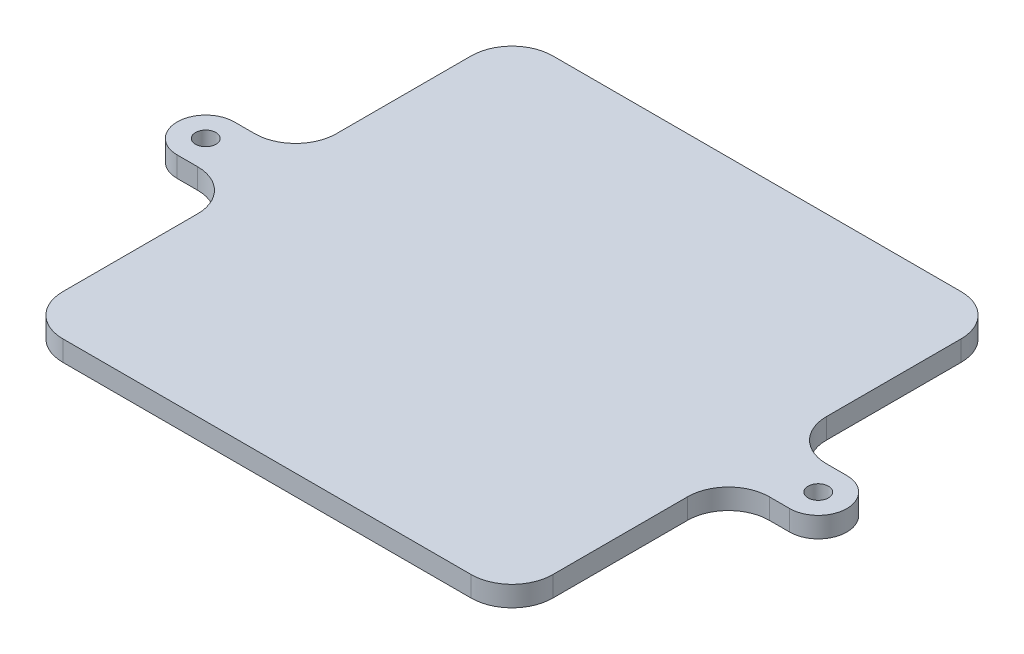
ISO-10303-21;
HEADER;
FILE_DESCRIPTION(('STEP AP214'),'2;1');
FILE_NAME('part.step','',(''),(''),'','','');
FILE_SCHEMA(('AUTOMOTIVE_DESIGN { 1 0 10303 214 1 1 1 1 }'));
ENDSEC;
DATA;
#1=APPLICATION_CONTEXT('core data for automotive mechanical design processes');
#2=APPLICATION_PROTOCOL_DEFINITION('international standard','automotive_design',2000,#1);
#3=PRODUCT_CONTEXT('',#1,'mechanical');
#4=PRODUCT('Part','Part','',(#3));
#5=PRODUCT_RELATED_PRODUCT_CATEGORY('part','',(#4));
#6=PRODUCT_DEFINITION_FORMATION('','',#4);
#7=PRODUCT_DEFINITION_CONTEXT('part definition',#1,'design');
#8=PRODUCT_DEFINITION('design','',#6,#7);
#9=PRODUCT_DEFINITION_SHAPE('','',#8);
#10=(LENGTH_UNIT() NAMED_UNIT(*) SI_UNIT(.MILLI.,.METRE.));
#11=(NAMED_UNIT(*) PLANE_ANGLE_UNIT() SI_UNIT($,.RADIAN.));
#12=(NAMED_UNIT(*) SI_UNIT($,.STERADIAN.) SOLID_ANGLE_UNIT());
#13=UNCERTAINTY_MEASURE_WITH_UNIT(LENGTH_MEASURE(1.E-05),#10,'distance_accuracy_value','');
#14=(GEOMETRIC_REPRESENTATION_CONTEXT(3) GLOBAL_UNCERTAINTY_ASSIGNED_CONTEXT((#13)) GLOBAL_UNIT_ASSIGNED_CONTEXT((#10,
#11,#12)) REPRESENTATION_CONTEXT('',''));
#15=CARTESIAN_POINT('',(0.,0.,0.));
#16=DIRECTION('',(0.,0.,1.));
#17=DIRECTION('',(1.,0.,0.));
#18=AXIS2_PLACEMENT_3D('',#15,#16,#17);
#19=CARTESIAN_POINT('',(70.,5.,17.));
#20=DIRECTION('',(0.,-1.,0.));
#21=DIRECTION('',(0.,0.,-1.));
#22=AXIS2_PLACEMENT_3D('',#19,#20,#21);
#23=PLANE('',#22);
#24=CARTESIAN_POINT('',(70.,5.,17.));
#25=DIRECTION('',(0.,-1.,0.));
#26=DIRECTION('',(0.,0.,-1.));
#27=AXIS2_PLACEMENT_3D('',#24,#25,#26);
#28=CIRCLE('',#27,10.);
#29=CARTESIAN_POINT('',(60.,5.,17.));
#30=VERTEX_POINT('',#29);
#31=CARTESIAN_POINT('',(70.,5.,6.99999999999999));
#32=VERTEX_POINT('',#31);
#33=EDGE_CURVE('E245',#30,#32,#28,.T.);
#34=ORIENTED_EDGE('',*,*,#33,.T.);
#35=DIRECTION('',(1.,0.,0.));
#36=VECTOR('',#35,1.);
#37=CARTESIAN_POINT('',(70.,5.,6.99999999999999));
#38=LINE('',#37,#36);
#39=CARTESIAN_POINT('',(75.,5.,6.99999999999999));
#40=VERTEX_POINT('',#39);
#41=EDGE_CURVE('E133',#32,#40,#38,.T.);
#42=ORIENTED_EDGE('',*,*,#41,.T.);
#43=CARTESIAN_POINT('',(75.,5.,0.));
#44=DIRECTION('',(0.,1.,0.));
#45=DIRECTION('',(0.,0.,-1.));
#46=AXIS2_PLACEMENT_3D('',#43,#44,#45);
#47=CIRCLE('',#46,7.);
#48=CARTESIAN_POINT('',(75.,5.,-7.00000000000001));
#49=VERTEX_POINT('',#48);
#50=EDGE_CURVE('E296',#40,#49,#47,.T.);
#51=ORIENTED_EDGE('',*,*,#50,.T.);
#52=DIRECTION('',(-1.,0.,0.));
#53=VECTOR('',#52,1.);
#54=CARTESIAN_POINT('',(70.,5.,-7.00000000000001));
#55=LINE('',#54,#53);
#56=CARTESIAN_POINT('',(70.,5.,-7.00000000000002));
#57=VERTEX_POINT('',#56);
#58=EDGE_CURVE('E315',#49,#57,#55,.T.);
#59=ORIENTED_EDGE('',*,*,#58,.T.);
#60=CARTESIAN_POINT('',(70.,5.,-17.));
#61=DIRECTION('',(0.,-1.,0.));
#62=DIRECTION('',(0.,0.,1.));
#63=AXIS2_PLACEMENT_3D('',#60,#61,#62);
#64=CIRCLE('',#63,9.99999999999999);
#65=CARTESIAN_POINT('',(60.,5.,-17.));
#66=VERTEX_POINT('',#65);
#67=EDGE_CURVE('E312',#57,#66,#64,.T.);
#68=ORIENTED_EDGE('',*,*,#67,.T.);
#69=DIRECTION('',(0.,0.,-1.));
#70=VECTOR('',#69,1.);
#71=CARTESIAN_POINT('',(60.,5.,-17.));
#72=LINE('',#71,#70);
#73=CARTESIAN_POINT('',(60.,5.,-49.9999999999999));
#74=VERTEX_POINT('',#73);
#75=EDGE_CURVE('E314',#66,#74,#72,.T.);
#76=ORIENTED_EDGE('',*,*,#75,.T.);
#77=CARTESIAN_POINT('',(50.,5.,-50.));
#78=DIRECTION('',(0.,1.,0.));
#79=DIRECTION('',(0.,0.,-1.));
#80=AXIS2_PLACEMENT_3D('',#77,#78,#79);
#81=CIRCLE('',#80,10.);
#82=CARTESIAN_POINT('',(49.9999999999999,5.,-60.));
#83=VERTEX_POINT('',#82);
#84=EDGE_CURVE('E317',#74,#83,#81,.T.);
#85=ORIENTED_EDGE('',*,*,#84,.T.);
#86=DIRECTION('',(-1.,0.,0.));
#87=VECTOR('',#86,1.);
#88=CARTESIAN_POINT('',(-49.9999999999999,5.,-60.));
#89=LINE('',#88,#87);
#90=CARTESIAN_POINT('',(-50.,5.,-60.));
#91=VERTEX_POINT('',#90);
#92=EDGE_CURVE('E323',#83,#91,#89,.T.);
#93=ORIENTED_EDGE('',*,*,#92,.T.);
#94=CARTESIAN_POINT('',(-50.,5.,-50.));
#95=DIRECTION('',(0.,1.,0.));
#96=DIRECTION('',(0.,0.,-1.));
#97=AXIS2_PLACEMENT_3D('',#94,#95,#96);
#98=CIRCLE('',#97,10.);
#99=CARTESIAN_POINT('',(-60.,5.,-49.9999999999999));
#100=VERTEX_POINT('',#99);
#101=EDGE_CURVE('E325',#91,#100,#98,.T.);
#102=ORIENTED_EDGE('',*,*,#101,.T.);
#103=DIRECTION('',(0.,0.,1.));
#104=VECTOR('',#103,1.);
#105=CARTESIAN_POINT('',(-60.,5.,-17.));
#106=LINE('',#105,#104);
#107=CARTESIAN_POINT('',(-60.,5.,-17.));
#108=VERTEX_POINT('',#107);
#109=EDGE_CURVE('E327',#100,#108,#106,.T.);
#110=ORIENTED_EDGE('',*,*,#109,.T.);
#111=CARTESIAN_POINT('',(-70.,5.,-17.));
#112=DIRECTION('',(0.,-1.,0.));
#113=DIRECTION('',(0.,0.,-1.));
#114=AXIS2_PLACEMENT_3D('',#111,#112,#113);
#115=CIRCLE('',#114,10.);
#116=CARTESIAN_POINT('',(-70.,5.,-6.99999999999999));
#117=VERTEX_POINT('',#116);
#118=EDGE_CURVE('E329',#108,#117,#115,.T.);
#119=ORIENTED_EDGE('',*,*,#118,.T.);
#120=DIRECTION('',(-1.,0.,0.));
#121=VECTOR('',#120,1.);
#122=CARTESIAN_POINT('',(-70.,5.,-6.99999999999999));
#123=LINE('',#122,#121);
#124=CARTESIAN_POINT('',(-75.,5.,-6.99999999999999));
#125=VERTEX_POINT('',#124);
#126=EDGE_CURVE('E331',#117,#125,#123,.T.);
#127=ORIENTED_EDGE('',*,*,#126,.T.);
#128=CARTESIAN_POINT('',(-75.,5.,0.));
#129=DIRECTION('',(0.,1.,0.));
#130=DIRECTION('',(0.,0.,1.));
#131=AXIS2_PLACEMENT_3D('',#128,#129,#130);
#132=CIRCLE('',#131,7.);
#133=CARTESIAN_POINT('',(-75.,5.,7.00000000000001));
#134=VERTEX_POINT('',#133);
#135=EDGE_CURVE('E333',#125,#134,#132,.T.);
#136=ORIENTED_EDGE('',*,*,#135,.T.);
#137=DIRECTION('',(1.,0.,0.));
#138=VECTOR('',#137,1.);
#139=CARTESIAN_POINT('',(-70.,5.,7.00000000000001));
#140=LINE('',#139,#138);
#141=CARTESIAN_POINT('',(-70.,5.,7.00000000000002));
#142=VERTEX_POINT('',#141);
#143=EDGE_CURVE('E335',#134,#142,#140,.T.);
#144=ORIENTED_EDGE('',*,*,#143,.T.);
#145=CARTESIAN_POINT('',(-70.,5.,17.));
#146=DIRECTION('',(0.,-1.,0.));
#147=DIRECTION('',(0.,0.,1.));
#148=AXIS2_PLACEMENT_3D('',#145,#146,#147);
#149=CIRCLE('',#148,9.99999999999999);
#150=CARTESIAN_POINT('',(-60.,5.,17.));
#151=VERTEX_POINT('',#150);
#152=EDGE_CURVE('E337',#142,#151,#149,.T.);
#153=ORIENTED_EDGE('',*,*,#152,.T.);
#154=DIRECTION('',(0.,0.,1.));
#155=VECTOR('',#154,1.);
#156=CARTESIAN_POINT('',(-60.,5.,49.9999999999999));
#157=LINE('',#156,#155);
#158=CARTESIAN_POINT('',(-60.,5.,49.9999999999999));
#159=VERTEX_POINT('',#158);
#160=EDGE_CURVE('E339',#151,#159,#157,.T.);
#161=ORIENTED_EDGE('',*,*,#160,.T.);
#162=CARTESIAN_POINT('',(-50.,5.,50.));
#163=DIRECTION('',(0.,1.,0.));
#164=DIRECTION('',(0.,0.,-1.));
#165=AXIS2_PLACEMENT_3D('',#162,#163,#164);
#166=CIRCLE('',#165,10.);
#167=CARTESIAN_POINT('',(-49.9999999999999,5.,60.));
#168=VERTEX_POINT('',#167);
#169=EDGE_CURVE('E188',#159,#168,#166,.T.);
#170=ORIENTED_EDGE('',*,*,#169,.T.);
#171=DIRECTION('',(1.,0.,0.));
#172=VECTOR('',#171,1.);
#173=CARTESIAN_POINT('',(-49.9999999999999,5.,60.));
#174=LINE('',#173,#172);
#175=CARTESIAN_POINT('',(49.9999999999999,5.,60.));
#176=VERTEX_POINT('',#175);
#177=EDGE_CURVE('E182',#168,#176,#174,.T.);
#178=ORIENTED_EDGE('',*,*,#177,.T.);
#179=CARTESIAN_POINT('',(50.,5.,50.));
#180=DIRECTION('',(0.,1.,0.));
#181=DIRECTION('',(0.,0.,1.));
#182=AXIS2_PLACEMENT_3D('',#179,#180,#181);
#183=CIRCLE('',#182,10.);
#184=CARTESIAN_POINT('',(60.,5.,49.9999999999999));
#185=VERTEX_POINT('',#184);
#186=EDGE_CURVE('E186',#176,#185,#183,.T.);
#187=ORIENTED_EDGE('',*,*,#186,.T.);
#188=DIRECTION('',(0.,0.,-1.));
#189=VECTOR('',#188,1.);
#190=CARTESIAN_POINT('',(60.,5.,49.9999999999999));
#191=LINE('',#190,#189);
#192=EDGE_CURVE('E54',#185,#30,#191,.T.);
#193=ORIENTED_EDGE('',*,*,#192,.T.);
#194=EDGE_LOOP('',(#34,#42,#51,#59,#68,#76,#85,#93,#102,#110,#119,#127,#136,#144,#153,#161,#170,
#178,#187,#193));
#195=FACE_BOUND('',#194,.T.);
#196=CARTESIAN_POINT('',(-75.,5.,0.));
#197=DIRECTION('',(0.,1.,0.));
#198=DIRECTION('',(0.,0.,1.));
#199=AXIS2_PLACEMENT_3D('',#196,#197,#198);
#200=CIRCLE('',#199,2.49999999999999);
#201=CARTESIAN_POINT('',(-75.,5.,2.5));
#202=VERTEX_POINT('',#201);
#203=EDGE_CURVE('E210',#202,#202,#200,.T.);
#204=ORIENTED_EDGE('',*,*,#203,.F.);
#205=EDGE_LOOP('',(#204));
#206=FACE_BOUND('',#205,.T.);
#207=CARTESIAN_POINT('',(75.,5.,0.));
#208=DIRECTION('',(0.,1.,0.));
#209=DIRECTION('',(0.,0.,-1.));
#210=AXIS2_PLACEMENT_3D('',#207,#208,#209);
#211=CIRCLE('',#210,2.49999999999999);
#212=CARTESIAN_POINT('',(75.,5.,-2.5));
#213=VERTEX_POINT('',#212);
#214=EDGE_CURVE('E380',#213,#213,#211,.T.);
#215=ORIENTED_EDGE('',*,*,#214,.F.);
#216=EDGE_LOOP('',(#215));
#217=FACE_BOUND('',#216,.T.);
#218=ADVANCED_FACE('F37',(#195,#206,#217),#23,.F.);
#219=CARTESIAN_POINT('',(70.,0.,17.));
#220=DIRECTION('',(0.,-1.,0.));
#221=DIRECTION('',(0.,0.,-1.));
#222=AXIS2_PLACEMENT_3D('',#219,#220,#221);
#223=PLANE('',#222);
#224=CARTESIAN_POINT('',(-75.,0.,0.));
#225=DIRECTION('',(0.,1.,0.));
#226=DIRECTION('',(0.,0.,1.));
#227=AXIS2_PLACEMENT_3D('',#224,#225,#226);
#228=CIRCLE('',#227,2.49999999999999);
#229=CARTESIAN_POINT('',(-75.,0.,2.5));
#230=VERTEX_POINT('',#229);
#231=EDGE_CURVE('E385',#230,#230,#228,.T.);
#232=ORIENTED_EDGE('',*,*,#231,.T.);
#233=EDGE_LOOP('',(#232));
#234=FACE_BOUND('',#233,.T.);
#235=CARTESIAN_POINT('',(70.,0.,17.));
#236=DIRECTION('',(0.,-1.,0.));
#237=DIRECTION('',(0.,0.,-1.));
#238=AXIS2_PLACEMENT_3D('',#235,#236,#237);
#239=CIRCLE('',#238,10.);
#240=CARTESIAN_POINT('',(60.,0.,17.));
#241=VERTEX_POINT('',#240);
#242=CARTESIAN_POINT('',(70.,0.,6.99999999999999));
#243=VERTEX_POINT('',#242);
#244=EDGE_CURVE('E206',#241,#243,#239,.T.);
#245=ORIENTED_EDGE('',*,*,#244,.F.);
#246=DIRECTION('',(0.,0.,-1.));
#247=VECTOR('',#246,1.);
#248=CARTESIAN_POINT('',(60.,0.,49.9999999999999));
#249=LINE('',#248,#247);
#250=CARTESIAN_POINT('',(60.,0.,49.9999999999999));
#251=VERTEX_POINT('',#250);
#252=EDGE_CURVE('E125',#251,#241,#249,.T.);
#253=ORIENTED_EDGE('',*,*,#252,.F.);
#254=CARTESIAN_POINT('',(50.,0.,50.));
#255=DIRECTION('',(0.,1.,0.));
#256=DIRECTION('',(0.,0.,1.));
#257=AXIS2_PLACEMENT_3D('',#254,#255,#256);
#258=CIRCLE('',#257,10.);
#259=CARTESIAN_POINT('',(49.9999999999999,0.,60.));
#260=VERTEX_POINT('',#259);
#261=EDGE_CURVE('E119',#260,#251,#258,.T.);
#262=ORIENTED_EDGE('',*,*,#261,.F.);
#263=DIRECTION('',(1.,0.,0.));
#264=VECTOR('',#263,1.);
#265=CARTESIAN_POINT('',(-49.9999999999999,0.,60.));
#266=LINE('',#265,#264);
#267=CARTESIAN_POINT('',(-49.9999999999999,0.,60.));
#268=VERTEX_POINT('',#267);
#269=EDGE_CURVE('E196',#268,#260,#266,.T.);
#270=ORIENTED_EDGE('',*,*,#269,.F.);
#271=CARTESIAN_POINT('',(-50.,0.,50.));
#272=DIRECTION('',(0.,1.,0.));
#273=DIRECTION('',(0.,0.,-1.));
#274=AXIS2_PLACEMENT_3D('',#271,#272,#273);
#275=CIRCLE('',#274,10.);
#276=CARTESIAN_POINT('',(-60.,0.,49.9999999999999));
#277=VERTEX_POINT('',#276);
#278=EDGE_CURVE('E240',#277,#268,#275,.T.);
#279=ORIENTED_EDGE('',*,*,#278,.F.);
#280=DIRECTION('',(0.,0.,1.));
#281=VECTOR('',#280,1.);
#282=CARTESIAN_POINT('',(-60.,0.,49.9999999999999));
#283=LINE('',#282,#281);
#284=CARTESIAN_POINT('',(-60.,0.,17.));
#285=VERTEX_POINT('',#284);
#286=EDGE_CURVE('E238',#285,#277,#283,.T.);
#287=ORIENTED_EDGE('',*,*,#286,.F.);
#288=CARTESIAN_POINT('',(-70.,0.,17.));
#289=DIRECTION('',(0.,-1.,0.));
#290=DIRECTION('',(0.,0.,1.));
#291=AXIS2_PLACEMENT_3D('',#288,#289,#290);
#292=CIRCLE('',#291,9.99999999999999);
#293=CARTESIAN_POINT('',(-70.,0.,7.00000000000002));
#294=VERTEX_POINT('',#293);
#295=EDGE_CURVE('E236',#294,#285,#292,.T.);
#296=ORIENTED_EDGE('',*,*,#295,.F.);
#297=DIRECTION('',(1.,0.,0.));
#298=VECTOR('',#297,1.);
#299=CARTESIAN_POINT('',(-70.,0.,7.00000000000001));
#300=LINE('',#299,#298);
#301=CARTESIAN_POINT('',(-75.,0.,7.00000000000001));
#302=VERTEX_POINT('',#301);
#303=EDGE_CURVE('E234',#302,#294,#300,.T.);
#304=ORIENTED_EDGE('',*,*,#303,.F.);
#305=CARTESIAN_POINT('',(-75.,0.,0.));
#306=DIRECTION('',(0.,1.,0.));
#307=DIRECTION('',(0.,0.,1.));
#308=AXIS2_PLACEMENT_3D('',#305,#306,#307);
#309=CIRCLE('',#308,7.);
#310=CARTESIAN_POINT('',(-75.,0.,-6.99999999999999));
#311=VERTEX_POINT('',#310);
#312=EDGE_CURVE('E232',#311,#302,#309,.T.);
#313=ORIENTED_EDGE('',*,*,#312,.F.);
#314=DIRECTION('',(-1.,0.,0.));
#315=VECTOR('',#314,1.);
#316=CARTESIAN_POINT('',(-70.,0.,-6.99999999999999));
#317=LINE('',#316,#315);
#318=CARTESIAN_POINT('',(-70.,0.,-6.99999999999999));
#319=VERTEX_POINT('',#318);
#320=EDGE_CURVE('E230',#319,#311,#317,.T.);
#321=ORIENTED_EDGE('',*,*,#320,.F.);
#322=CARTESIAN_POINT('',(-70.,0.,-17.));
#323=DIRECTION('',(0.,-1.,0.));
#324=DIRECTION('',(0.,0.,-1.));
#325=AXIS2_PLACEMENT_3D('',#322,#323,#324);
#326=CIRCLE('',#325,10.);
#327=CARTESIAN_POINT('',(-60.,0.,-17.));
#328=VERTEX_POINT('',#327);
#329=EDGE_CURVE('E228',#328,#319,#326,.T.);
#330=ORIENTED_EDGE('',*,*,#329,.F.);
#331=DIRECTION('',(0.,0.,1.));
#332=VECTOR('',#331,1.);
#333=CARTESIAN_POINT('',(-60.,0.,-17.));
#334=LINE('',#333,#332);
#335=CARTESIAN_POINT('',(-60.,0.,-49.9999999999999));
#336=VERTEX_POINT('',#335);
#337=EDGE_CURVE('E226',#336,#328,#334,.T.);
#338=ORIENTED_EDGE('',*,*,#337,.F.);
#339=CARTESIAN_POINT('',(-50.,0.,-50.));
#340=DIRECTION('',(0.,1.,0.));
#341=DIRECTION('',(0.,0.,-1.));
#342=AXIS2_PLACEMENT_3D('',#339,#340,#341);
#343=CIRCLE('',#342,10.);
#344=CARTESIAN_POINT('',(-50.,0.,-60.));
#345=VERTEX_POINT('',#344);
#346=EDGE_CURVE('E224',#345,#336,#343,.T.);
#347=ORIENTED_EDGE('',*,*,#346,.F.);
#348=DIRECTION('',(-1.,0.,0.));
#349=VECTOR('',#348,1.);
#350=CARTESIAN_POINT('',(-49.9999999999999,0.,-60.));
#351=LINE('',#350,#349);
#352=CARTESIAN_POINT('',(49.9999999999999,0.,-60.));
#353=VERTEX_POINT('',#352);
#354=EDGE_CURVE('E222',#353,#345,#351,.T.);
#355=ORIENTED_EDGE('',*,*,#354,.F.);
#356=CARTESIAN_POINT('',(50.,0.,-50.));
#357=DIRECTION('',(0.,1.,0.));
#358=DIRECTION('',(0.,0.,-1.));
#359=AXIS2_PLACEMENT_3D('',#356,#357,#358);
#360=CIRCLE('',#359,10.);
#361=CARTESIAN_POINT('',(60.,0.,-49.9999999999999));
#362=VERTEX_POINT('',#361);
#363=EDGE_CURVE('E220',#362,#353,#360,.T.);
#364=ORIENTED_EDGE('',*,*,#363,.F.);
#365=DIRECTION('',(0.,0.,-1.));
#366=VECTOR('',#365,1.);
#367=CARTESIAN_POINT('',(60.,0.,-17.));
#368=LINE('',#367,#366);
#369=CARTESIAN_POINT('',(60.,0.,-17.));
#370=VERTEX_POINT('',#369);
#371=EDGE_CURVE('E218',#370,#362,#368,.T.);
#372=ORIENTED_EDGE('',*,*,#371,.F.);
#373=CARTESIAN_POINT('',(70.,0.,-17.));
#374=DIRECTION('',(0.,-1.,0.));
#375=DIRECTION('',(0.,0.,1.));
#376=AXIS2_PLACEMENT_3D('',#373,#374,#375);
#377=CIRCLE('',#376,9.99999999999999);
#378=CARTESIAN_POINT('',(70.,0.,-7.00000000000002));
#379=VERTEX_POINT('',#378);
#380=EDGE_CURVE('E216',#379,#370,#377,.T.);
#381=ORIENTED_EDGE('',*,*,#380,.F.);
#382=DIRECTION('',(-1.,0.,0.));
#383=VECTOR('',#382,1.);
#384=CARTESIAN_POINT('',(70.,0.,-7.00000000000001));
#385=LINE('',#384,#383);
#386=CARTESIAN_POINT('',(75.,0.,-7.00000000000001));
#387=VERTEX_POINT('',#386);
#388=EDGE_CURVE('E214',#387,#379,#385,.T.);
#389=ORIENTED_EDGE('',*,*,#388,.F.);
#390=CARTESIAN_POINT('',(75.,0.,0.));
#391=DIRECTION('',(0.,1.,0.));
#392=DIRECTION('',(0.,0.,-1.));
#393=AXIS2_PLACEMENT_3D('',#390,#391,#392);
#394=CIRCLE('',#393,7.);
#395=CARTESIAN_POINT('',(75.,0.,6.99999999999999));
#396=VERTEX_POINT('',#395);
#397=EDGE_CURVE('E212',#396,#387,#394,.T.);
#398=ORIENTED_EDGE('',*,*,#397,.F.);
#399=DIRECTION('',(1.,0.,0.));
#400=VECTOR('',#399,1.);
#401=CARTESIAN_POINT('',(70.,0.,6.99999999999999));
#402=LINE('',#401,#400);
#403=EDGE_CURVE('E209',#243,#396,#402,.T.);
#404=ORIENTED_EDGE('',*,*,#403,.F.);
#405=EDGE_LOOP('',(#245,#253,#262,#270,#279,#287,#296,#304,#313,#321,#330,#338,#347,#355,#364,
#372,#381,#389,#398,#404));
#406=FACE_BOUND('',#405,.T.);
#407=CARTESIAN_POINT('',(75.,0.,0.));
#408=DIRECTION('',(0.,1.,0.));
#409=DIRECTION('',(0.,0.,-1.));
#410=AXIS2_PLACEMENT_3D('',#407,#408,#409);
#411=CIRCLE('',#410,2.49999999999999);
#412=CARTESIAN_POINT('',(75.,0.,-2.5));
#413=VERTEX_POINT('',#412);
#414=EDGE_CURVE('E383',#413,#413,#411,.T.);
#415=ORIENTED_EDGE('',*,*,#414,.T.);
#416=EDGE_LOOP('',(#415));
#417=FACE_BOUND('',#416,.T.);
#418=ADVANCED_FACE('F300',(#234,#406,#417),#223,.T.);
#419=CARTESIAN_POINT('',(70.,5.,17.));
#420=DIRECTION('',(0.,-1.,0.));
#421=DIRECTION('',(0.,0.,-1.));
#422=AXIS2_PLACEMENT_3D('',#419,#420,#421);
#423=CYLINDRICAL_SURFACE('',#422,10.);
#424=ORIENTED_EDGE('',*,*,#244,.T.);
#425=DIRECTION('',(0.,-1.,0.));
#426=VECTOR('',#425,1.);
#427=CARTESIAN_POINT('',(70.,5.,6.99999999999999));
#428=LINE('',#427,#426);
#429=EDGE_CURVE('E11',#32,#243,#428,.T.);
#430=ORIENTED_EDGE('',*,*,#429,.F.);
#431=ORIENTED_EDGE('',*,*,#33,.F.);
#432=DIRECTION('',(0.,-1.,0.));
#433=VECTOR('',#432,1.);
#434=CARTESIAN_POINT('',(60.,5.,17.));
#435=LINE('',#434,#433);
#436=EDGE_CURVE('E202',#30,#241,#435,.T.);
#437=ORIENTED_EDGE('',*,*,#436,.T.);
#438=EDGE_LOOP('',(#424,#430,#431,#437));
#439=FACE_BOUND('',#438,.T.);
#440=ADVANCED_FACE('F39',(#439),#423,.F.);
#441=CARTESIAN_POINT('',(70.,5.,6.99999999999999));
#442=DIRECTION('',(0.,0.,-1.));
#443=DIRECTION('',(-1.,0.,0.));
#444=AXIS2_PLACEMENT_3D('',#441,#442,#443);
#445=PLANE('',#444);
#446=ORIENTED_EDGE('',*,*,#403,.T.);
#447=DIRECTION('',(0.,-1.,0.));
#448=VECTOR('',#447,1.);
#449=CARTESIAN_POINT('',(75.,5.,6.99999999999999));
#450=LINE('',#449,#448);
#451=EDGE_CURVE('E46',#40,#396,#450,.T.);
#452=ORIENTED_EDGE('',*,*,#451,.F.);
#453=ORIENTED_EDGE('',*,*,#41,.F.);
#454=ORIENTED_EDGE('',*,*,#429,.T.);
#455=EDGE_LOOP('',(#446,#452,#453,#454));
#456=FACE_BOUND('',#455,.T.);
#457=ADVANCED_FACE('F578',(#456),#445,.F.);
#458=CARTESIAN_POINT('',(75.,5.,0.));
#459=DIRECTION('',(0.,-1.,0.));
#460=DIRECTION('',(0.,0.,-1.));
#461=AXIS2_PLACEMENT_3D('',#458,#459,#460);
#462=CYLINDRICAL_SURFACE('',#461,7.);
#463=ORIENTED_EDGE('',*,*,#397,.T.);
#464=DIRECTION('',(0.,-1.,0.));
#465=VECTOR('',#464,1.);
#466=CARTESIAN_POINT('',(75.,5.,-7.00000000000001));
#467=LINE('',#466,#465);
#468=EDGE_CURVE('E288',#49,#387,#467,.T.);
#469=ORIENTED_EDGE('',*,*,#468,.F.);
#470=ORIENTED_EDGE('',*,*,#50,.F.);
#471=ORIENTED_EDGE('',*,*,#451,.T.);
#472=EDGE_LOOP('',(#463,#469,#470,#471));
#473=FACE_BOUND('',#472,.T.);
#474=ADVANCED_FACE('F294',(#473),#462,.T.);
#475=CARTESIAN_POINT('',(70.,5.,-7.00000000000001));
#476=DIRECTION('',(0.,0.,1.));
#477=DIRECTION('',(1.,0.,0.));
#478=AXIS2_PLACEMENT_3D('',#475,#476,#477);
#479=PLANE('',#478);
#480=ORIENTED_EDGE('',*,*,#388,.T.);
#481=DIRECTION('',(0.,-1.,0.));
#482=VECTOR('',#481,1.);
#483=CARTESIAN_POINT('',(70.,5.,-7.00000000000002));
#484=LINE('',#483,#482);
#485=EDGE_CURVE('E285',#57,#379,#484,.T.);
#486=ORIENTED_EDGE('',*,*,#485,.F.);
#487=ORIENTED_EDGE('',*,*,#58,.F.);
#488=ORIENTED_EDGE('',*,*,#468,.T.);
#489=EDGE_LOOP('',(#480,#486,#487,#488));
#490=FACE_BOUND('',#489,.T.);
#491=ADVANCED_FACE('F306',(#490),#479,.F.);
#492=CARTESIAN_POINT('',(70.,5.,-17.));
#493=DIRECTION('',(0.,-1.,0.));
#494=DIRECTION('',(0.,0.,-1.));
#495=AXIS2_PLACEMENT_3D('',#492,#493,#494);
#496=CYLINDRICAL_SURFACE('',#495,9.99999999999999);
#497=ORIENTED_EDGE('',*,*,#380,.T.);
#498=DIRECTION('',(0.,-1.,0.));
#499=VECTOR('',#498,1.);
#500=CARTESIAN_POINT('',(60.,5.,-17.));
#501=LINE('',#500,#499);
#502=EDGE_CURVE('E282',#66,#370,#501,.T.);
#503=ORIENTED_EDGE('',*,*,#502,.F.);
#504=ORIENTED_EDGE('',*,*,#67,.F.);
#505=ORIENTED_EDGE('',*,*,#485,.T.);
#506=EDGE_LOOP('',(#497,#503,#504,#505));
#507=FACE_BOUND('',#506,.T.);
#508=ADVANCED_FACE('F310',(#507),#496,.F.);
#509=CARTESIAN_POINT('',(60.,5.,-17.));
#510=DIRECTION('',(-1.,0.,0.));
#511=DIRECTION('',(0.,0.,1.));
#512=AXIS2_PLACEMENT_3D('',#509,#510,#511);
#513=PLANE('',#512);
#514=ORIENTED_EDGE('',*,*,#371,.T.);
#515=DIRECTION('',(0.,-1.,0.));
#516=VECTOR('',#515,1.);
#517=CARTESIAN_POINT('',(60.,5.,-49.9999999999999));
#518=LINE('',#517,#516);
#519=EDGE_CURVE('E279',#74,#362,#518,.T.);
#520=ORIENTED_EDGE('',*,*,#519,.F.);
#521=ORIENTED_EDGE('',*,*,#75,.F.);
#522=ORIENTED_EDGE('',*,*,#502,.T.);
#523=EDGE_LOOP('',(#514,#520,#521,#522));
#524=FACE_BOUND('',#523,.T.);
#525=ADVANCED_FACE('F539',(#524),#513,.F.);
#526=CARTESIAN_POINT('',(50.,5.,-50.));
#527=DIRECTION('',(0.,-1.,0.));
#528=DIRECTION('',(0.,0.,-1.));
#529=AXIS2_PLACEMENT_3D('',#526,#527,#528);
#530=CYLINDRICAL_SURFACE('',#529,10.);
#531=ORIENTED_EDGE('',*,*,#363,.T.);
#532=DIRECTION('',(0.,-1.,0.));
#533=VECTOR('',#532,1.);
#534=CARTESIAN_POINT('',(49.9999999999999,5.,-60.));
#535=LINE('',#534,#533);
#536=EDGE_CURVE('E276',#83,#353,#535,.T.);
#537=ORIENTED_EDGE('',*,*,#536,.F.);
#538=ORIENTED_EDGE('',*,*,#84,.F.);
#539=ORIENTED_EDGE('',*,*,#519,.T.);
#540=EDGE_LOOP('',(#531,#537,#538,#539));
#541=FACE_BOUND('',#540,.T.);
#542=ADVANCED_FACE('F528',(#541),#530,.T.);
#543=CARTESIAN_POINT('',(-49.9999999999999,5.,-60.));
#544=DIRECTION('',(0.,0.,1.));
#545=DIRECTION('',(1.,0.,0.));
#546=AXIS2_PLACEMENT_3D('',#543,#544,#545);
#547=PLANE('',#546);
#548=ORIENTED_EDGE('',*,*,#354,.T.);
#549=DIRECTION('',(0.,-1.,0.));
#550=VECTOR('',#549,1.);
#551=CARTESIAN_POINT('',(-50.,5.,-60.));
#552=LINE('',#551,#550);
#553=EDGE_CURVE('E273',#91,#345,#552,.T.);
#554=ORIENTED_EDGE('',*,*,#553,.F.);
#555=ORIENTED_EDGE('',*,*,#92,.F.);
#556=ORIENTED_EDGE('',*,*,#536,.T.);
#557=EDGE_LOOP('',(#548,#554,#555,#556));
#558=FACE_BOUND('',#557,.T.);
#559=ADVANCED_FACE('F517',(#558),#547,.F.);
#560=CARTESIAN_POINT('',(-50.,5.,-50.));
#561=DIRECTION('',(0.,-1.,0.));
#562=DIRECTION('',(0.,0.,-1.));
#563=AXIS2_PLACEMENT_3D('',#560,#561,#562);
#564=CYLINDRICAL_SURFACE('',#563,10.);
#565=ORIENTED_EDGE('',*,*,#346,.T.);
#566=DIRECTION('',(0.,-1.,0.));
#567=VECTOR('',#566,1.);
#568=CARTESIAN_POINT('',(-60.,5.,-49.9999999999999));
#569=LINE('',#568,#567);
#570=EDGE_CURVE('E270',#100,#336,#569,.T.);
#571=ORIENTED_EDGE('',*,*,#570,.F.);
#572=ORIENTED_EDGE('',*,*,#101,.F.);
#573=ORIENTED_EDGE('',*,*,#553,.T.);
#574=EDGE_LOOP('',(#565,#571,#572,#573));
#575=FACE_BOUND('',#574,.T.);
#576=ADVANCED_FACE('F506',(#575),#564,.T.);
#577=CARTESIAN_POINT('',(-60.,5.,-17.));
#578=DIRECTION('',(1.,0.,0.));
#579=DIRECTION('',(0.,0.,-1.));
#580=AXIS2_PLACEMENT_3D('',#577,#578,#579);
#581=PLANE('',#580);
#582=ORIENTED_EDGE('',*,*,#337,.T.);
#583=DIRECTION('',(0.,-1.,0.));
#584=VECTOR('',#583,1.);
#585=CARTESIAN_POINT('',(-60.,5.,-17.));
#586=LINE('',#585,#584);
#587=EDGE_CURVE('E267',#108,#328,#586,.T.);
#588=ORIENTED_EDGE('',*,*,#587,.F.);
#589=ORIENTED_EDGE('',*,*,#109,.F.);
#590=ORIENTED_EDGE('',*,*,#570,.T.);
#591=EDGE_LOOP('',(#582,#588,#589,#590));
#592=FACE_BOUND('',#591,.T.);
#593=ADVANCED_FACE('F495',(#592),#581,.F.);
#594=CARTESIAN_POINT('',(-70.,5.,-17.));
#595=DIRECTION('',(0.,-1.,0.));
#596=DIRECTION('',(0.,0.,-1.));
#597=AXIS2_PLACEMENT_3D('',#594,#595,#596);
#598=CYLINDRICAL_SURFACE('',#597,10.);
#599=ORIENTED_EDGE('',*,*,#329,.T.);
#600=DIRECTION('',(0.,-1.,0.));
#601=VECTOR('',#600,1.);
#602=CARTESIAN_POINT('',(-70.,5.,-6.99999999999999));
#603=LINE('',#602,#601);
#604=EDGE_CURVE('E264',#117,#319,#603,.T.);
#605=ORIENTED_EDGE('',*,*,#604,.F.);
#606=ORIENTED_EDGE('',*,*,#118,.F.);
#607=ORIENTED_EDGE('',*,*,#587,.T.);
#608=EDGE_LOOP('',(#599,#605,#606,#607));
#609=FACE_BOUND('',#608,.T.);
#610=ADVANCED_FACE('F484',(#609),#598,.F.);
#611=CARTESIAN_POINT('',(-70.,5.,-6.99999999999999));
#612=DIRECTION('',(0.,0.,1.));
#613=DIRECTION('',(1.,0.,0.));
#614=AXIS2_PLACEMENT_3D('',#611,#612,#613);
#615=PLANE('',#614);
#616=ORIENTED_EDGE('',*,*,#320,.T.);
#617=DIRECTION('',(0.,-1.,0.));
#618=VECTOR('',#617,1.);
#619=CARTESIAN_POINT('',(-75.,5.,-6.99999999999999));
#620=LINE('',#619,#618);
#621=EDGE_CURVE('E261',#125,#311,#620,.T.);
#622=ORIENTED_EDGE('',*,*,#621,.F.);
#623=ORIENTED_EDGE('',*,*,#126,.F.);
#624=ORIENTED_EDGE('',*,*,#604,.T.);
#625=EDGE_LOOP('',(#616,#622,#623,#624));
#626=FACE_BOUND('',#625,.T.);
#627=ADVANCED_FACE('F473',(#626),#615,.F.);
#628=CARTESIAN_POINT('',(-75.,5.,0.));
#629=DIRECTION('',(0.,-1.,0.));
#630=DIRECTION('',(0.,0.,-1.));
#631=AXIS2_PLACEMENT_3D('',#628,#629,#630);
#632=CYLINDRICAL_SURFACE('',#631,7.);
#633=ORIENTED_EDGE('',*,*,#312,.T.);
#634=DIRECTION('',(0.,-1.,0.));
#635=VECTOR('',#634,1.);
#636=CARTESIAN_POINT('',(-75.,5.,7.00000000000001));
#637=LINE('',#636,#635);
#638=EDGE_CURVE('E258',#134,#302,#637,.T.);
#639=ORIENTED_EDGE('',*,*,#638,.F.);
#640=ORIENTED_EDGE('',*,*,#135,.F.);
#641=ORIENTED_EDGE('',*,*,#621,.T.);
#642=EDGE_LOOP('',(#633,#639,#640,#641));
#643=FACE_BOUND('',#642,.T.);
#644=ADVANCED_FACE('F462',(#643),#632,.T.);
#645=CARTESIAN_POINT('',(-70.,5.,7.00000000000001));
#646=DIRECTION('',(0.,0.,-1.));
#647=DIRECTION('',(-1.,0.,0.));
#648=AXIS2_PLACEMENT_3D('',#645,#646,#647);
#649=PLANE('',#648);
#650=ORIENTED_EDGE('',*,*,#303,.T.);
#651=DIRECTION('',(0.,-1.,0.));
#652=VECTOR('',#651,1.);
#653=CARTESIAN_POINT('',(-70.,5.,7.00000000000002));
#654=LINE('',#653,#652);
#655=EDGE_CURVE('E255',#142,#294,#654,.T.);
#656=ORIENTED_EDGE('',*,*,#655,.F.);
#657=ORIENTED_EDGE('',*,*,#143,.F.);
#658=ORIENTED_EDGE('',*,*,#638,.T.);
#659=EDGE_LOOP('',(#650,#656,#657,#658));
#660=FACE_BOUND('',#659,.T.);
#661=ADVANCED_FACE('F451',(#660),#649,.F.);
#662=CARTESIAN_POINT('',(-70.,5.,17.));
#663=DIRECTION('',(0.,-1.,0.));
#664=DIRECTION('',(0.,0.,-1.));
#665=AXIS2_PLACEMENT_3D('',#662,#663,#664);
#666=CYLINDRICAL_SURFACE('',#665,9.99999999999999);
#667=ORIENTED_EDGE('',*,*,#295,.T.);
#668=DIRECTION('',(0.,-1.,0.));
#669=VECTOR('',#668,1.);
#670=CARTESIAN_POINT('',(-60.,5.,17.));
#671=LINE('',#670,#669);
#672=EDGE_CURVE('E252',#151,#285,#671,.T.);
#673=ORIENTED_EDGE('',*,*,#672,.F.);
#674=ORIENTED_EDGE('',*,*,#152,.F.);
#675=ORIENTED_EDGE('',*,*,#655,.T.);
#676=EDGE_LOOP('',(#667,#673,#674,#675));
#677=FACE_BOUND('',#676,.T.);
#678=ADVANCED_FACE('F441',(#677),#666,.F.);
#679=CARTESIAN_POINT('',(-60.,5.,49.9999999999999));
#680=DIRECTION('',(1.,0.,0.));
#681=DIRECTION('',(0.,0.,-1.));
#682=AXIS2_PLACEMENT_3D('',#679,#680,#681);
#683=PLANE('',#682);
#684=ORIENTED_EDGE('',*,*,#286,.T.);
#685=DIRECTION('',(0.,-1.,0.));
#686=VECTOR('',#685,1.);
#687=CARTESIAN_POINT('',(-60.,5.,49.9999999999999));
#688=LINE('',#687,#686);
#689=EDGE_CURVE('E249',#159,#277,#688,.T.);
#690=ORIENTED_EDGE('',*,*,#689,.F.);
#691=ORIENTED_EDGE('',*,*,#160,.F.);
#692=ORIENTED_EDGE('',*,*,#672,.T.);
#693=EDGE_LOOP('',(#684,#690,#691,#692));
#694=FACE_BOUND('',#693,.T.);
#695=ADVANCED_FACE('F345',(#694),#683,.F.);
#696=CARTESIAN_POINT('',(-50.,5.,50.));
#697=DIRECTION('',(0.,-1.,0.));
#698=DIRECTION('',(0.,0.,-1.));
#699=AXIS2_PLACEMENT_3D('',#696,#697,#698);
#700=CYLINDRICAL_SURFACE('',#699,10.);
#701=ORIENTED_EDGE('',*,*,#278,.T.);
#702=DIRECTION('',(0.,-1.,0.));
#703=VECTOR('',#702,1.);
#704=CARTESIAN_POINT('',(-49.9999999999999,5.,60.));
#705=LINE('',#704,#703);
#706=EDGE_CURVE('E197',#168,#268,#705,.T.);
#707=ORIENTED_EDGE('',*,*,#706,.F.);
#708=ORIENTED_EDGE('',*,*,#169,.F.);
#709=ORIENTED_EDGE('',*,*,#689,.T.);
#710=EDGE_LOOP('',(#701,#707,#708,#709));
#711=FACE_BOUND('',#710,.T.);
#712=ADVANCED_FACE('F349',(#711),#700,.T.);
#713=CARTESIAN_POINT('',(-49.9999999999999,5.,60.));
#714=DIRECTION('',(0.,0.,-1.));
#715=DIRECTION('',(-1.,0.,0.));
#716=AXIS2_PLACEMENT_3D('',#713,#714,#715);
#717=PLANE('',#716);
#718=ORIENTED_EDGE('',*,*,#269,.T.);
#719=DIRECTION('',(0.,-1.,0.));
#720=VECTOR('',#719,1.);
#721=CARTESIAN_POINT('',(49.9999999999999,5.,60.));
#722=LINE('',#721,#720);
#723=EDGE_CURVE('E193',#176,#260,#722,.T.);
#724=ORIENTED_EDGE('',*,*,#723,.F.);
#725=ORIENTED_EDGE('',*,*,#177,.F.);
#726=ORIENTED_EDGE('',*,*,#706,.T.);
#727=EDGE_LOOP('',(#718,#724,#725,#726));
#728=FACE_BOUND('',#727,.T.);
#729=ADVANCED_FACE('F194',(#728),#717,.F.);
#730=CARTESIAN_POINT('',(50.,5.,50.));
#731=DIRECTION('',(0.,-1.,0.));
#732=DIRECTION('',(0.,0.,-1.));
#733=AXIS2_PLACEMENT_3D('',#730,#731,#732);
#734=CYLINDRICAL_SURFACE('',#733,10.);
#735=ORIENTED_EDGE('',*,*,#261,.T.);
#736=DIRECTION('',(0.,-1.,0.));
#737=VECTOR('',#736,1.);
#738=CARTESIAN_POINT('',(60.,5.,49.9999999999999));
#739=LINE('',#738,#737);
#740=EDGE_CURVE('E198',#185,#251,#739,.T.);
#741=ORIENTED_EDGE('',*,*,#740,.F.);
#742=ORIENTED_EDGE('',*,*,#186,.F.);
#743=ORIENTED_EDGE('',*,*,#723,.T.);
#744=EDGE_LOOP('',(#735,#741,#742,#743));
#745=FACE_BOUND('',#744,.T.);
#746=ADVANCED_FACE('F200',(#745),#734,.T.);
#747=CARTESIAN_POINT('',(60.,5.,49.9999999999999));
#748=DIRECTION('',(-1.,0.,0.));
#749=DIRECTION('',(0.,0.,1.));
#750=AXIS2_PLACEMENT_3D('',#747,#748,#749);
#751=PLANE('',#750);
#752=ORIENTED_EDGE('',*,*,#252,.T.);
#753=ORIENTED_EDGE('',*,*,#436,.F.);
#754=ORIENTED_EDGE('',*,*,#192,.F.);
#755=ORIENTED_EDGE('',*,*,#740,.T.);
#756=EDGE_LOOP('',(#752,#753,#754,#755));
#757=FACE_BOUND('',#756,.T.);
#758=ADVANCED_FACE('F353',(#757),#751,.F.);
#759=CARTESIAN_POINT('',(-75.,5.,0.));
#760=DIRECTION('',(0.,-1.,0.));
#761=DIRECTION('',(0.,0.,-1.));
#762=AXIS2_PLACEMENT_3D('',#759,#760,#761);
#763=CYLINDRICAL_SURFACE('',#762,2.49999999999999);
#764=ORIENTED_EDGE('',*,*,#203,.T.);
#765=EDGE_LOOP('',(#764));
#766=FACE_BOUND('',#765,.T.);
#767=ORIENTED_EDGE('',*,*,#231,.F.);
#768=EDGE_LOOP('',(#767));
#769=FACE_BOUND('',#768,.T.);
#770=ADVANCED_FACE('F355',(#766,#769),#763,.F.);
#771=CARTESIAN_POINT('',(75.,5.,0.));
#772=DIRECTION('',(0.,-1.,0.));
#773=DIRECTION('',(0.,0.,-1.));
#774=AXIS2_PLACEMENT_3D('',#771,#772,#773);
#775=CYLINDRICAL_SURFACE('',#774,2.49999999999999);
#776=ORIENTED_EDGE('',*,*,#214,.T.);
#777=EDGE_LOOP('',(#776));
#778=FACE_BOUND('',#777,.T.);
#779=ORIENTED_EDGE('',*,*,#414,.F.);
#780=EDGE_LOOP('',(#779));
#781=FACE_BOUND('',#780,.T.);
#782=ADVANCED_FACE('F361',(#778,#781),#775,.F.);
#783=CLOSED_SHELL('',(#218,#418,#440,#457,#474,#491,#508,#525,#542,#559,#576,#593,#610,#627,
#644,#661,#678,#695,#712,#729,#746,#758,#770,#782));
#784=MANIFOLD_SOLID_BREP('B2',#783);
#785=ADVANCED_BREP_SHAPE_REPRESENTATION('',(#18,#784),#14);
#786=SHAPE_DEFINITION_REPRESENTATION(#9,#785);
ENDSEC;
END-ISO-10303-21;
